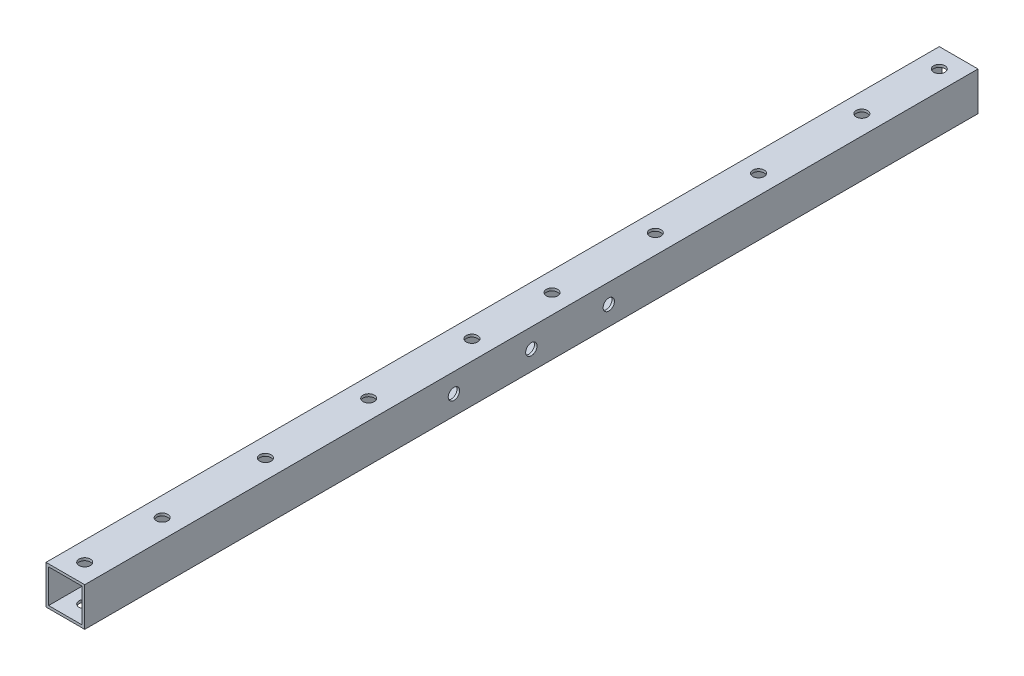
ISO-10303-21;
HEADER;
FILE_DESCRIPTION(('STEP AP214'),'2;1');
FILE_NAME('part.step','',(''),(''),'','','');
FILE_SCHEMA(('AUTOMOTIVE_DESIGN { 1 0 10303 214 1 1 1 1 }'));
ENDSEC;
DATA;
#1=APPLICATION_CONTEXT('core data for automotive mechanical design processes');
#2=APPLICATION_PROTOCOL_DEFINITION('international standard','automotive_design',2000,#1);
#3=PRODUCT_CONTEXT('',#1,'mechanical');
#4=PRODUCT('Part','Part','',(#3));
#5=PRODUCT_RELATED_PRODUCT_CATEGORY('part','',(#4));
#6=PRODUCT_DEFINITION_FORMATION('','',#4);
#7=PRODUCT_DEFINITION_CONTEXT('part definition',#1,'design');
#8=PRODUCT_DEFINITION('design','',#6,#7);
#9=PRODUCT_DEFINITION_SHAPE('','',#8);
#10=(LENGTH_UNIT() NAMED_UNIT(*) SI_UNIT(.MILLI.,.METRE.));
#11=(NAMED_UNIT(*) PLANE_ANGLE_UNIT() SI_UNIT($,.RADIAN.));
#12=(NAMED_UNIT(*) SI_UNIT($,.STERADIAN.) SOLID_ANGLE_UNIT());
#13=UNCERTAINTY_MEASURE_WITH_UNIT(LENGTH_MEASURE(1.E-05),#10,'distance_accuracy_value','');
#14=(GEOMETRIC_REPRESENTATION_CONTEXT(3) GLOBAL_UNCERTAINTY_ASSIGNED_CONTEXT((#13)) GLOBAL_UNIT_ASSIGNED_CONTEXT((#10,
#11,#12)) REPRESENTATION_CONTEXT('',''));
#15=CARTESIAN_POINT('',(0.,0.,0.));
#16=DIRECTION('',(0.,0.,1.));
#17=DIRECTION('',(1.,0.,0.));
#18=AXIS2_PLACEMENT_3D('',#15,#16,#17);
#19=CARTESIAN_POINT('',(0.,0.,346.));
#20=DIRECTION('',(0.,0.,1.));
#21=DIRECTION('',(1.,0.,0.));
#22=AXIS2_PLACEMENT_3D('',#19,#20,#21);
#23=PLANE('',#22);
#24=DIRECTION('',(0.,1.,0.));
#25=VECTOR('',#24,1.);
#26=CARTESIAN_POINT('',(7.5,7.5,346.));
#27=LINE('',#26,#25);
#28=CARTESIAN_POINT('',(7.5,-7.5,346.));
#29=VERTEX_POINT('',#28);
#30=CARTESIAN_POINT('',(7.5,7.5,346.));
#31=VERTEX_POINT('',#30);
#32=EDGE_CURVE('E143',#29,#31,#27,.T.);
#33=ORIENTED_EDGE('',*,*,#32,.T.);
#34=DIRECTION('',(-1.,0.,0.));
#35=VECTOR('',#34,1.);
#36=CARTESIAN_POINT('',(-7.5,7.5,346.));
#37=LINE('',#36,#35);
#38=CARTESIAN_POINT('',(-7.5,7.5,346.));
#39=VERTEX_POINT('',#38);
#40=EDGE_CURVE('E146',#31,#39,#37,.T.);
#41=ORIENTED_EDGE('',*,*,#40,.T.);
#42=DIRECTION('',(0.,-1.,0.));
#43=VECTOR('',#42,1.);
#44=CARTESIAN_POINT('',(-7.5,7.5,346.));
#45=LINE('',#44,#43);
#46=CARTESIAN_POINT('',(-7.5,-7.5,346.));
#47=VERTEX_POINT('',#46);
#48=EDGE_CURVE('E149',#39,#47,#45,.T.);
#49=ORIENTED_EDGE('',*,*,#48,.T.);
#50=DIRECTION('',(1.,0.,0.));
#51=VECTOR('',#50,1.);
#52=CARTESIAN_POINT('',(-7.5,-7.5,346.));
#53=LINE('',#52,#51);
#54=EDGE_CURVE('E151',#47,#29,#53,.T.);
#55=ORIENTED_EDGE('',*,*,#54,.T.);
#56=EDGE_LOOP('',(#33,#41,#49,#55));
#57=FACE_BOUND('',#56,.T.);
#58=DIRECTION('',(-1.,0.,0.));
#59=VECTOR('',#58,1.);
#60=CARTESIAN_POINT('',(-6.5,6.5,346.));
#61=LINE('',#60,#59);
#62=CARTESIAN_POINT('',(6.5,6.5,346.));
#63=VERTEX_POINT('',#62);
#64=CARTESIAN_POINT('',(-6.5,6.5,346.));
#65=VERTEX_POINT('',#64);
#66=EDGE_CURVE('E113',#63,#65,#61,.T.);
#67=ORIENTED_EDGE('',*,*,#66,.F.);
#68=DIRECTION('',(0.,1.,0.));
#69=VECTOR('',#68,1.);
#70=CARTESIAN_POINT('',(6.5,6.5,346.));
#71=LINE('',#70,#69);
#72=CARTESIAN_POINT('',(6.5,-6.5,346.));
#73=VERTEX_POINT('',#72);
#74=EDGE_CURVE('E105',#73,#63,#71,.T.);
#75=ORIENTED_EDGE('',*,*,#74,.F.);
#76=DIRECTION('',(1.,0.,0.));
#77=VECTOR('',#76,1.);
#78=CARTESIAN_POINT('',(-6.5,-6.5,346.));
#79=LINE('',#78,#77);
#80=CARTESIAN_POINT('',(-6.5,-6.5,346.));
#81=VERTEX_POINT('',#80);
#82=EDGE_CURVE('E127',#81,#73,#79,.T.);
#83=ORIENTED_EDGE('',*,*,#82,.F.);
#84=DIRECTION('',(0.,-1.,0.));
#85=VECTOR('',#84,1.);
#86=CARTESIAN_POINT('',(-6.5,6.5,346.));
#87=LINE('',#86,#85);
#88=EDGE_CURVE('E125',#65,#81,#87,.T.);
#89=ORIENTED_EDGE('',*,*,#88,.F.);
#90=EDGE_LOOP('',(#67,#75,#83,#89));
#91=FACE_BOUND('',#90,.T.);
#92=ADVANCED_FACE('F38',(#57,#91),#23,.T.);
#93=CARTESIAN_POINT('',(0.,0.,0.));
#94=DIRECTION('',(0.,0.,1.));
#95=DIRECTION('',(1.,0.,0.));
#96=AXIS2_PLACEMENT_3D('',#93,#94,#95);
#97=PLANE('',#96);
#98=DIRECTION('',(0.,1.,0.));
#99=VECTOR('',#98,1.);
#100=CARTESIAN_POINT('',(7.5,7.5,0.));
#101=LINE('',#100,#99);
#102=CARTESIAN_POINT('',(7.5,-7.5,0.));
#103=VERTEX_POINT('',#102);
#104=CARTESIAN_POINT('',(7.5,7.5,0.));
#105=VERTEX_POINT('',#104);
#106=EDGE_CURVE('E121',#103,#105,#101,.T.);
#107=ORIENTED_EDGE('',*,*,#106,.F.);
#108=DIRECTION('',(1.,0.,0.));
#109=VECTOR('',#108,1.);
#110=CARTESIAN_POINT('',(-7.5,-7.5,0.));
#111=LINE('',#110,#109);
#112=CARTESIAN_POINT('',(-7.5,-7.5,0.));
#113=VERTEX_POINT('',#112);
#114=EDGE_CURVE('E147',#113,#103,#111,.T.);
#115=ORIENTED_EDGE('',*,*,#114,.F.);
#116=DIRECTION('',(0.,-1.,0.));
#117=VECTOR('',#116,1.);
#118=CARTESIAN_POINT('',(-7.5,7.5,0.));
#119=LINE('',#118,#117);
#120=CARTESIAN_POINT('',(-7.5,7.5,0.));
#121=VERTEX_POINT('',#120);
#122=EDGE_CURVE('E158',#121,#113,#119,.T.);
#123=ORIENTED_EDGE('',*,*,#122,.F.);
#124=DIRECTION('',(-1.,0.,0.));
#125=VECTOR('',#124,1.);
#126=CARTESIAN_POINT('',(-7.5,7.5,0.));
#127=LINE('',#126,#125);
#128=EDGE_CURVE('E156',#105,#121,#127,.T.);
#129=ORIENTED_EDGE('',*,*,#128,.F.);
#130=EDGE_LOOP('',(#107,#115,#123,#129));
#131=FACE_BOUND('',#130,.T.);
#132=DIRECTION('',(0.,1.,0.));
#133=VECTOR('',#132,1.);
#134=CARTESIAN_POINT('',(6.5,6.5,0.));
#135=LINE('',#134,#133);
#136=CARTESIAN_POINT('',(6.5,-6.5,0.));
#137=VERTEX_POINT('',#136);
#138=CARTESIAN_POINT('',(6.5,6.5,0.));
#139=VERTEX_POINT('',#138);
#140=EDGE_CURVE('E63',#137,#139,#135,.T.);
#141=ORIENTED_EDGE('',*,*,#140,.T.);
#142=DIRECTION('',(-1.,0.,0.));
#143=VECTOR('',#142,1.);
#144=CARTESIAN_POINT('',(-6.5,6.5,0.));
#145=LINE('',#144,#143);
#146=CARTESIAN_POINT('',(-6.5,6.5,0.));
#147=VERTEX_POINT('',#146);
#148=EDGE_CURVE('E120',#139,#147,#145,.T.);
#149=ORIENTED_EDGE('',*,*,#148,.T.);
#150=DIRECTION('',(0.,-1.,0.));
#151=VECTOR('',#150,1.);
#152=CARTESIAN_POINT('',(-6.5,6.5,0.));
#153=LINE('',#152,#151);
#154=CARTESIAN_POINT('',(-6.5,-6.5,0.));
#155=VERTEX_POINT('',#154);
#156=EDGE_CURVE('E135',#147,#155,#153,.T.);
#157=ORIENTED_EDGE('',*,*,#156,.T.);
#158=DIRECTION('',(1.,0.,0.));
#159=VECTOR('',#158,1.);
#160=CARTESIAN_POINT('',(-6.5,-6.5,0.));
#161=LINE('',#160,#159);
#162=EDGE_CURVE('E114',#155,#137,#161,.T.);
#163=ORIENTED_EDGE('',*,*,#162,.T.);
#164=EDGE_LOOP('',(#141,#149,#157,#163));
#165=FACE_BOUND('',#164,.T.);
#166=ADVANCED_FACE('F343',(#131,#165),#97,.F.);
#167=CARTESIAN_POINT('',(7.5,7.5,346.));
#168=DIRECTION('',(-1.,0.,0.));
#169=DIRECTION('',(0.,0.,1.));
#170=AXIS2_PLACEMENT_3D('',#167,#168,#169);
#171=PLANE('',#170);
#172=CARTESIAN_POINT('',(7.5,0.,143.));
#173=DIRECTION('',(1.,0.,0.));
#174=DIRECTION('',(0.,0.,-1.));
#175=AXIS2_PLACEMENT_3D('',#172,#173,#174);
#176=CIRCLE('',#175,2.20000000000001);
#177=CARTESIAN_POINT('',(7.5,0.,140.8));
#178=VERTEX_POINT('',#177);
#179=EDGE_CURVE('E832',#178,#178,#176,.T.);
#180=ORIENTED_EDGE('',*,*,#179,.F.);
#181=EDGE_LOOP('',(#180));
#182=FACE_BOUND('',#181,.T.);
#183=CARTESIAN_POINT('',(7.5,0.,203.));
#184=DIRECTION('',(1.,0.,0.));
#185=DIRECTION('',(0.,0.,-1.));
#186=AXIS2_PLACEMENT_3D('',#183,#184,#185);
#187=CIRCLE('',#186,2.20000000000001);
#188=CARTESIAN_POINT('',(7.5,0.,200.8));
#189=VERTEX_POINT('',#188);
#190=EDGE_CURVE('E833',#189,#189,#187,.T.);
#191=ORIENTED_EDGE('',*,*,#190,.F.);
#192=EDGE_LOOP('',(#191));
#193=FACE_BOUND('',#192,.T.);
#194=CARTESIAN_POINT('',(7.5,0.,173.));
#195=DIRECTION('',(1.,0.,0.));
#196=DIRECTION('',(0.,0.,-1.));
#197=AXIS2_PLACEMENT_3D('',#194,#195,#196);
#198=CIRCLE('',#197,2.20000000000001);
#199=CARTESIAN_POINT('',(7.5,0.,170.8));
#200=VERTEX_POINT('',#199);
#201=EDGE_CURVE('E221',#200,#200,#198,.T.);
#202=ORIENTED_EDGE('',*,*,#201,.F.);
#203=EDGE_LOOP('',(#202));
#204=FACE_BOUND('',#203,.T.);
#205=ORIENTED_EDGE('',*,*,#106,.T.);
#206=DIRECTION('',(0.,0.,-1.));
#207=VECTOR('',#206,1.);
#208=CARTESIAN_POINT('',(7.5,7.5,346.));
#209=LINE('',#208,#207);
#210=EDGE_CURVE('E11',#31,#105,#209,.T.);
#211=ORIENTED_EDGE('',*,*,#210,.F.);
#212=ORIENTED_EDGE('',*,*,#32,.F.);
#213=DIRECTION('',(0.,0.,-1.));
#214=VECTOR('',#213,1.);
#215=CARTESIAN_POINT('',(7.5,-7.5,346.));
#216=LINE('',#215,#214);
#217=EDGE_CURVE('E153',#29,#103,#216,.T.);
#218=ORIENTED_EDGE('',*,*,#217,.T.);
#219=EDGE_LOOP('',(#205,#211,#212,#218));
#220=FACE_BOUND('',#219,.T.);
#221=ADVANCED_FACE('F40',(#182,#193,#204,#220),#171,.F.);
#222=CARTESIAN_POINT('',(-7.5,7.5,346.));
#223=DIRECTION('',(0.,-1.,0.));
#224=DIRECTION('',(0.,0.,-1.));
#225=AXIS2_PLACEMENT_3D('',#222,#223,#224);
#226=PLANE('',#225);
#227=CARTESIAN_POINT('',(0.,7.5,338.5));
#228=DIRECTION('',(0.,1.,0.));
#229=DIRECTION('',(0.,0.,1.));
#230=AXIS2_PLACEMENT_3D('',#227,#228,#229);
#231=CIRCLE('',#230,2.19999999999999);
#232=CARTESIAN_POINT('',(0.,7.5,340.7));
#233=VERTEX_POINT('',#232);
#234=EDGE_CURVE('E172',#233,#233,#231,.T.);
#235=ORIENTED_EDGE('',*,*,#234,.F.);
#236=EDGE_LOOP('',(#235));
#237=FACE_BOUND('',#236,.T.);
#238=CARTESIAN_POINT('',(0.,7.5,188.5));
#239=DIRECTION('',(0.,1.,0.));
#240=DIRECTION('',(0.,0.,-1.));
#241=AXIS2_PLACEMENT_3D('',#238,#239,#240);
#242=CIRCLE('',#241,2.2);
#243=CARTESIAN_POINT('',(0.,7.5,186.3));
#244=VERTEX_POINT('',#243);
#245=EDGE_CURVE('E247',#244,#244,#242,.T.);
#246=ORIENTED_EDGE('',*,*,#245,.F.);
#247=EDGE_LOOP('',(#246));
#248=FACE_BOUND('',#247,.T.);
#249=CARTESIAN_POINT('',(0.,7.5,7.5));
#250=DIRECTION('',(0.,1.,0.));
#251=DIRECTION('',(0.,0.,1.));
#252=AXIS2_PLACEMENT_3D('',#249,#250,#251);
#253=CIRCLE('',#252,2.2);
#254=CARTESIAN_POINT('',(0.,7.5,9.7));
#255=VERTEX_POINT('',#254);
#256=EDGE_CURVE('E250',#255,#255,#253,.T.);
#257=ORIENTED_EDGE('',*,*,#256,.F.);
#258=EDGE_LOOP('',(#257));
#259=FACE_BOUND('',#258,.T.);
#260=CARTESIAN_POINT('',(0.,7.5,37.5));
#261=DIRECTION('',(0.,1.,0.));
#262=DIRECTION('',(0.,0.,1.));
#263=AXIS2_PLACEMENT_3D('',#260,#261,#262);
#264=CIRCLE('',#263,2.2);
#265=CARTESIAN_POINT('',(0.,7.5,39.7));
#266=VERTEX_POINT('',#265);
#267=EDGE_CURVE('E268',#266,#266,#264,.T.);
#268=ORIENTED_EDGE('',*,*,#267,.F.);
#269=EDGE_LOOP('',(#268));
#270=FACE_BOUND('',#269,.T.);
#271=CARTESIAN_POINT('',(0.,7.5,308.5));
#272=DIRECTION('',(0.,1.,0.));
#273=DIRECTION('',(0.,0.,1.));
#274=AXIS2_PLACEMENT_3D('',#271,#272,#273);
#275=CIRCLE('',#274,2.19999999999998);
#276=CARTESIAN_POINT('',(0.,7.5,310.7));
#277=VERTEX_POINT('',#276);
#278=EDGE_CURVE('E271',#277,#277,#275,.T.);
#279=ORIENTED_EDGE('',*,*,#278,.F.);
#280=EDGE_LOOP('',(#279));
#281=FACE_BOUND('',#280,.T.);
#282=CARTESIAN_POINT('',(0.,7.5,77.5));
#283=DIRECTION('',(0.,1.,0.));
#284=DIRECTION('',(0.,0.,1.));
#285=AXIS2_PLACEMENT_3D('',#282,#283,#284);
#286=CIRCLE('',#285,2.2);
#287=CARTESIAN_POINT('',(0.,7.5,79.7));
#288=VERTEX_POINT('',#287);
#289=EDGE_CURVE('E263',#288,#288,#286,.T.);
#290=ORIENTED_EDGE('',*,*,#289,.F.);
#291=EDGE_LOOP('',(#290));
#292=FACE_BOUND('',#291,.T.);
#293=CARTESIAN_POINT('',(0.,7.5,157.5));
#294=DIRECTION('',(0.,1.,0.));
#295=DIRECTION('',(0.,0.,1.));
#296=AXIS2_PLACEMENT_3D('',#293,#294,#295);
#297=CIRCLE('',#296,2.2);
#298=CARTESIAN_POINT('',(0.,7.5,159.7));
#299=VERTEX_POINT('',#298);
#300=EDGE_CURVE('E253',#299,#299,#297,.T.);
#301=ORIENTED_EDGE('',*,*,#300,.F.);
#302=EDGE_LOOP('',(#301));
#303=FACE_BOUND('',#302,.T.);
#304=CARTESIAN_POINT('',(0.,7.5,268.5));
#305=DIRECTION('',(0.,1.,0.));
#306=DIRECTION('',(0.,0.,-1.));
#307=AXIS2_PLACEMENT_3D('',#304,#305,#306);
#308=CIRCLE('',#307,2.19999999999999);
#309=CARTESIAN_POINT('',(0.,7.5,266.3));
#310=VERTEX_POINT('',#309);
#311=EDGE_CURVE('E254',#310,#310,#308,.T.);
#312=ORIENTED_EDGE('',*,*,#311,.F.);
#313=EDGE_LOOP('',(#312));
#314=FACE_BOUND('',#313,.T.);
#315=CARTESIAN_POINT('',(0.,7.5,228.5));
#316=DIRECTION('',(0.,1.,0.));
#317=DIRECTION('',(0.,0.,-1.));
#318=AXIS2_PLACEMENT_3D('',#315,#316,#317);
#319=CIRCLE('',#318,2.19999999999999);
#320=CARTESIAN_POINT('',(0.,7.5,226.3));
#321=VERTEX_POINT('',#320);
#322=EDGE_CURVE('E257',#321,#321,#319,.T.);
#323=ORIENTED_EDGE('',*,*,#322,.F.);
#324=EDGE_LOOP('',(#323));
#325=FACE_BOUND('',#324,.T.);
#326=CARTESIAN_POINT('',(0.,7.5,117.5));
#327=DIRECTION('',(0.,1.,0.));
#328=DIRECTION('',(0.,0.,1.));
#329=AXIS2_PLACEMENT_3D('',#326,#327,#328);
#330=CIRCLE('',#329,2.2);
#331=CARTESIAN_POINT('',(0.,7.5,119.7));
#332=VERTEX_POINT('',#331);
#333=EDGE_CURVE('E260',#332,#332,#330,.T.);
#334=ORIENTED_EDGE('',*,*,#333,.F.);
#335=EDGE_LOOP('',(#334));
#336=FACE_BOUND('',#335,.T.);
#337=ORIENTED_EDGE('',*,*,#128,.T.);
#338=DIRECTION('',(0.,0.,-1.));
#339=VECTOR('',#338,1.);
#340=CARTESIAN_POINT('',(-7.5,7.5,346.));
#341=LINE('',#340,#339);
#342=EDGE_CURVE('E47',#39,#121,#341,.T.);
#343=ORIENTED_EDGE('',*,*,#342,.F.);
#344=ORIENTED_EDGE('',*,*,#40,.F.);
#345=ORIENTED_EDGE('',*,*,#210,.T.);
#346=EDGE_LOOP('',(#337,#343,#344,#345));
#347=FACE_BOUND('',#346,.T.);
#348=ADVANCED_FACE('F358',(#237,#248,#259,#270,#281,#292,#303,#314,#325,#336,#347),#226,.F.);
#349=CARTESIAN_POINT('',(-7.5,7.5,346.));
#350=DIRECTION('',(1.,0.,0.));
#351=DIRECTION('',(0.,0.,-1.));
#352=AXIS2_PLACEMENT_3D('',#349,#350,#351);
#353=PLANE('',#352);
#354=CARTESIAN_POINT('',(-7.49999999999999,0.,143.));
#355=DIRECTION('',(1.,0.,0.));
#356=DIRECTION('',(0.,0.,-1.));
#357=AXIS2_PLACEMENT_3D('',#354,#355,#356);
#358=CIRCLE('',#357,2.20000000000001);
#359=CARTESIAN_POINT('',(-7.49999999999999,0.,140.8));
#360=VERTEX_POINT('',#359);
#361=EDGE_CURVE('E244',#360,#360,#358,.T.);
#362=ORIENTED_EDGE('',*,*,#361,.T.);
#363=EDGE_LOOP('',(#362));
#364=FACE_BOUND('',#363,.T.);
#365=CARTESIAN_POINT('',(-7.49999999999999,0.,203.));
#366=DIRECTION('',(1.,0.,0.));
#367=DIRECTION('',(0.,0.,-1.));
#368=AXIS2_PLACEMENT_3D('',#365,#366,#367);
#369=CIRCLE('',#368,2.20000000000001);
#370=CARTESIAN_POINT('',(-7.49999999999999,0.,200.8));
#371=VERTEX_POINT('',#370);
#372=EDGE_CURVE('E229',#371,#371,#369,.T.);
#373=ORIENTED_EDGE('',*,*,#372,.T.);
#374=EDGE_LOOP('',(#373));
#375=FACE_BOUND('',#374,.T.);
#376=CARTESIAN_POINT('',(-7.49999999999999,0.,173.));
#377=DIRECTION('',(1.,0.,0.));
#378=DIRECTION('',(0.,0.,-1.));
#379=AXIS2_PLACEMENT_3D('',#376,#377,#378);
#380=CIRCLE('',#379,2.20000000000001);
#381=CARTESIAN_POINT('',(-7.49999999999999,0.,170.8));
#382=VERTEX_POINT('',#381);
#383=EDGE_CURVE('E225',#382,#382,#380,.T.);
#384=ORIENTED_EDGE('',*,*,#383,.T.);
#385=EDGE_LOOP('',(#384));
#386=FACE_BOUND('',#385,.T.);
#387=ORIENTED_EDGE('',*,*,#122,.T.);
#388=DIRECTION('',(0.,0.,-1.));
#389=VECTOR('',#388,1.);
#390=CARTESIAN_POINT('',(-7.5,-7.5,346.));
#391=LINE('',#390,#389);
#392=EDGE_CURVE('E163',#47,#113,#391,.T.);
#393=ORIENTED_EDGE('',*,*,#392,.F.);
#394=ORIENTED_EDGE('',*,*,#48,.F.);
#395=ORIENTED_EDGE('',*,*,#342,.T.);
#396=EDGE_LOOP('',(#387,#393,#394,#395));
#397=FACE_BOUND('',#396,.T.);
#398=ADVANCED_FACE('F356',(#364,#375,#386,#397),#353,.F.);
#399=CARTESIAN_POINT('',(-7.5,-7.5,346.));
#400=DIRECTION('',(0.,1.,0.));
#401=DIRECTION('',(0.,0.,1.));
#402=AXIS2_PLACEMENT_3D('',#399,#400,#401);
#403=PLANE('',#402);
#404=CARTESIAN_POINT('',(0.,-7.49999999999999,338.5));
#405=DIRECTION('',(0.,1.,0.));
#406=DIRECTION('',(0.,0.,1.));
#407=AXIS2_PLACEMENT_3D('',#404,#405,#406);
#408=CIRCLE('',#407,2.19999999999999);
#409=CARTESIAN_POINT('',(0.,-7.49999999999999,340.7));
#410=VERTEX_POINT('',#409);
#411=EDGE_CURVE('E133',#410,#410,#408,.T.);
#412=ORIENTED_EDGE('',*,*,#411,.T.);
#413=EDGE_LOOP('',(#412));
#414=FACE_BOUND('',#413,.T.);
#415=CARTESIAN_POINT('',(0.,-7.49999999999999,188.5));
#416=DIRECTION('',(0.,1.,0.));
#417=DIRECTION('',(0.,0.,1.));
#418=AXIS2_PLACEMENT_3D('',#415,#416,#417);
#419=CIRCLE('',#418,2.2);
#420=CARTESIAN_POINT('',(0.,-7.49999999999999,190.7));
#421=VERTEX_POINT('',#420);
#422=EDGE_CURVE('E217',#421,#421,#419,.T.);
#423=ORIENTED_EDGE('',*,*,#422,.T.);
#424=EDGE_LOOP('',(#423));
#425=FACE_BOUND('',#424,.T.);
#426=CARTESIAN_POINT('',(0.,-7.49999999999999,7.5));
#427=DIRECTION('',(0.,1.,0.));
#428=DIRECTION('',(0.,0.,1.));
#429=AXIS2_PLACEMENT_3D('',#426,#427,#428);
#430=CIRCLE('',#429,2.2);
#431=CARTESIAN_POINT('',(0.,-7.49999999999999,9.7));
#432=VERTEX_POINT('',#431);
#433=EDGE_CURVE('E212',#432,#432,#430,.T.);
#434=ORIENTED_EDGE('',*,*,#433,.T.);
#435=EDGE_LOOP('',(#434));
#436=FACE_BOUND('',#435,.T.);
#437=CARTESIAN_POINT('',(0.,-7.49999999999999,37.5));
#438=DIRECTION('',(0.,1.,0.));
#439=DIRECTION('',(0.,0.,1.));
#440=AXIS2_PLACEMENT_3D('',#437,#438,#439);
#441=CIRCLE('',#440,2.2);
#442=CARTESIAN_POINT('',(0.,-7.49999999999999,39.7));
#443=VERTEX_POINT('',#442);
#444=EDGE_CURVE('E207',#443,#443,#441,.T.);
#445=ORIENTED_EDGE('',*,*,#444,.T.);
#446=EDGE_LOOP('',(#445));
#447=FACE_BOUND('',#446,.T.);
#448=CARTESIAN_POINT('',(0.,-7.49999999999999,308.5));
#449=DIRECTION('',(0.,1.,0.));
#450=DIRECTION('',(0.,0.,1.));
#451=AXIS2_PLACEMENT_3D('',#448,#449,#450);
#452=CIRCLE('',#451,2.19999999999998);
#453=CARTESIAN_POINT('',(0.,-7.49999999999999,310.7));
#454=VERTEX_POINT('',#453);
#455=EDGE_CURVE('E202',#454,#454,#452,.T.);
#456=ORIENTED_EDGE('',*,*,#455,.T.);
#457=EDGE_LOOP('',(#456));
#458=FACE_BOUND('',#457,.T.);
#459=CARTESIAN_POINT('',(0.,-7.49999999999999,77.5));
#460=DIRECTION('',(0.,1.,0.));
#461=DIRECTION('',(0.,0.,1.));
#462=AXIS2_PLACEMENT_3D('',#459,#460,#461);
#463=CIRCLE('',#462,2.2);
#464=CARTESIAN_POINT('',(0.,-7.49999999999999,79.7));
#465=VERTEX_POINT('',#464);
#466=EDGE_CURVE('E197',#465,#465,#463,.T.);
#467=ORIENTED_EDGE('',*,*,#466,.T.);
#468=EDGE_LOOP('',(#467));
#469=FACE_BOUND('',#468,.T.);
#470=CARTESIAN_POINT('',(0.,-7.49999999999999,157.5));
#471=DIRECTION('',(0.,1.,0.));
#472=DIRECTION('',(0.,0.,1.));
#473=AXIS2_PLACEMENT_3D('',#470,#471,#472);
#474=CIRCLE('',#473,2.2);
#475=CARTESIAN_POINT('',(0.,-7.49999999999999,159.7));
#476=VERTEX_POINT('',#475);
#477=EDGE_CURVE('E192',#476,#476,#474,.T.);
#478=ORIENTED_EDGE('',*,*,#477,.T.);
#479=EDGE_LOOP('',(#478));
#480=FACE_BOUND('',#479,.T.);
#481=CARTESIAN_POINT('',(0.,-7.49999999999999,268.5));
#482=DIRECTION('',(0.,1.,0.));
#483=DIRECTION('',(0.,0.,1.));
#484=AXIS2_PLACEMENT_3D('',#481,#482,#483);
#485=CIRCLE('',#484,2.19999999999999);
#486=CARTESIAN_POINT('',(0.,-7.49999999999999,270.7));
#487=VERTEX_POINT('',#486);
#488=EDGE_CURVE('E187',#487,#487,#485,.T.);
#489=ORIENTED_EDGE('',*,*,#488,.T.);
#490=EDGE_LOOP('',(#489));
#491=FACE_BOUND('',#490,.T.);
#492=CARTESIAN_POINT('',(0.,-7.49999999999999,228.5));
#493=DIRECTION('',(0.,1.,0.));
#494=DIRECTION('',(0.,0.,1.));
#495=AXIS2_PLACEMENT_3D('',#492,#493,#494);
#496=CIRCLE('',#495,2.19999999999999);
#497=CARTESIAN_POINT('',(0.,-7.49999999999999,230.7));
#498=VERTEX_POINT('',#497);
#499=EDGE_CURVE('E182',#498,#498,#496,.T.);
#500=ORIENTED_EDGE('',*,*,#499,.T.);
#501=EDGE_LOOP('',(#500));
#502=FACE_BOUND('',#501,.T.);
#503=CARTESIAN_POINT('',(0.,-7.49999999999999,117.5));
#504=DIRECTION('',(0.,1.,0.));
#505=DIRECTION('',(0.,0.,1.));
#506=AXIS2_PLACEMENT_3D('',#503,#504,#505);
#507=CIRCLE('',#506,2.2);
#508=CARTESIAN_POINT('',(0.,-7.49999999999999,119.7));
#509=VERTEX_POINT('',#508);
#510=EDGE_CURVE('E177',#509,#509,#507,.T.);
#511=ORIENTED_EDGE('',*,*,#510,.T.);
#512=EDGE_LOOP('',(#511));
#513=FACE_BOUND('',#512,.T.);
#514=ORIENTED_EDGE('',*,*,#114,.T.);
#515=ORIENTED_EDGE('',*,*,#217,.F.);
#516=ORIENTED_EDGE('',*,*,#54,.F.);
#517=ORIENTED_EDGE('',*,*,#392,.T.);
#518=EDGE_LOOP('',(#514,#515,#516,#517));
#519=FACE_BOUND('',#518,.T.);
#520=ADVANCED_FACE('F316',(#414,#425,#436,#447,#458,#469,#480,#491,#502,#513,#519),#403,.F.);
#521=CARTESIAN_POINT('',(6.5,6.5,346.));
#522=DIRECTION('',(-1.,0.,0.));
#523=DIRECTION('',(0.,0.,1.));
#524=AXIS2_PLACEMENT_3D('',#521,#522,#523);
#525=PLANE('',#524);
#526=CARTESIAN_POINT('',(6.5,0.,143.));
#527=DIRECTION('',(-1.,0.,0.));
#528=DIRECTION('',(0.,0.,1.));
#529=AXIS2_PLACEMENT_3D('',#526,#527,#528);
#530=CIRCLE('',#529,2.20000000000001);
#531=CARTESIAN_POINT('',(6.5,0.,145.2));
#532=VERTEX_POINT('',#531);
#533=EDGE_CURVE('E241',#532,#532,#530,.T.);
#534=ORIENTED_EDGE('',*,*,#533,.F.);
#535=EDGE_LOOP('',(#534));
#536=FACE_BOUND('',#535,.T.);
#537=CARTESIAN_POINT('',(6.5,0.,203.));
#538=DIRECTION('',(-1.,0.,0.));
#539=DIRECTION('',(0.,0.,1.));
#540=AXIS2_PLACEMENT_3D('',#537,#538,#539);
#541=CIRCLE('',#540,2.20000000000001);
#542=CARTESIAN_POINT('',(6.5,0.,205.2));
#543=VERTEX_POINT('',#542);
#544=EDGE_CURVE('E224',#543,#543,#541,.T.);
#545=ORIENTED_EDGE('',*,*,#544,.F.);
#546=EDGE_LOOP('',(#545));
#547=FACE_BOUND('',#546,.T.);
#548=CARTESIAN_POINT('',(6.5,0.,173.));
#549=DIRECTION('',(-1.,0.,0.));
#550=DIRECTION('',(0.,0.,1.));
#551=AXIS2_PLACEMENT_3D('',#548,#549,#550);
#552=CIRCLE('',#551,2.20000000000001);
#553=CARTESIAN_POINT('',(6.5,0.,175.2));
#554=VERTEX_POINT('',#553);
#555=EDGE_CURVE('E220',#554,#554,#552,.T.);
#556=ORIENTED_EDGE('',*,*,#555,.F.);
#557=EDGE_LOOP('',(#556));
#558=FACE_BOUND('',#557,.T.);
#559=ORIENTED_EDGE('',*,*,#140,.F.);
#560=DIRECTION('',(0.,0.,-1.));
#561=VECTOR('',#560,1.);
#562=CARTESIAN_POINT('',(6.5,-6.5,346.));
#563=LINE('',#562,#561);
#564=EDGE_CURVE('E109',#73,#137,#563,.T.);
#565=ORIENTED_EDGE('',*,*,#564,.F.);
#566=ORIENTED_EDGE('',*,*,#74,.T.);
#567=DIRECTION('',(0.,0.,-1.));
#568=VECTOR('',#567,1.);
#569=CARTESIAN_POINT('',(6.5,6.5,346.));
#570=LINE('',#569,#568);
#571=EDGE_CURVE('E108',#63,#139,#570,.T.);
#572=ORIENTED_EDGE('',*,*,#571,.T.);
#573=EDGE_LOOP('',(#559,#565,#566,#572));
#574=FACE_BOUND('',#573,.T.);
#575=ADVANCED_FACE('F107',(#536,#547,#558,#574),#525,.T.);
#576=CARTESIAN_POINT('',(-6.5,6.5,346.));
#577=DIRECTION('',(0.,-1.,0.));
#578=DIRECTION('',(0.,0.,-1.));
#579=AXIS2_PLACEMENT_3D('',#576,#577,#578);
#580=PLANE('',#579);
#581=CARTESIAN_POINT('',(0.,6.5,338.5));
#582=DIRECTION('',(0.,-1.,0.));
#583=DIRECTION('',(0.,0.,-1.));
#584=AXIS2_PLACEMENT_3D('',#581,#582,#583);
#585=CIRCLE('',#584,2.19999999999999);
#586=CARTESIAN_POINT('',(0.,6.5,336.3));
#587=VERTEX_POINT('',#586);
#588=EDGE_CURVE('E216',#587,#587,#585,.T.);
#589=ORIENTED_EDGE('',*,*,#588,.F.);
#590=EDGE_LOOP('',(#589));
#591=FACE_BOUND('',#590,.T.);
#592=CARTESIAN_POINT('',(0.,6.5,188.5));
#593=DIRECTION('',(0.,-1.,0.));
#594=DIRECTION('',(0.,0.,-1.));
#595=AXIS2_PLACEMENT_3D('',#592,#593,#594);
#596=CIRCLE('',#595,2.2);
#597=CARTESIAN_POINT('',(0.,6.5,186.3));
#598=VERTEX_POINT('',#597);
#599=EDGE_CURVE('E211',#598,#598,#596,.T.);
#600=ORIENTED_EDGE('',*,*,#599,.F.);
#601=EDGE_LOOP('',(#600));
#602=FACE_BOUND('',#601,.T.);
#603=CARTESIAN_POINT('',(0.,6.5,7.5));
#604=DIRECTION('',(0.,-1.,0.));
#605=DIRECTION('',(0.,0.,-1.));
#606=AXIS2_PLACEMENT_3D('',#603,#604,#605);
#607=CIRCLE('',#606,2.2);
#608=CARTESIAN_POINT('',(0.,6.5,5.3));
#609=VERTEX_POINT('',#608);
#610=EDGE_CURVE('E206',#609,#609,#607,.T.);
#611=ORIENTED_EDGE('',*,*,#610,.F.);
#612=EDGE_LOOP('',(#611));
#613=FACE_BOUND('',#612,.T.);
#614=CARTESIAN_POINT('',(0.,6.5,37.5));
#615=DIRECTION('',(0.,-1.,0.));
#616=DIRECTION('',(0.,0.,-1.));
#617=AXIS2_PLACEMENT_3D('',#614,#615,#616);
#618=CIRCLE('',#617,2.2);
#619=CARTESIAN_POINT('',(0.,6.5,35.3));
#620=VERTEX_POINT('',#619);
#621=EDGE_CURVE('E201',#620,#620,#618,.T.);
#622=ORIENTED_EDGE('',*,*,#621,.F.);
#623=EDGE_LOOP('',(#622));
#624=FACE_BOUND('',#623,.T.);
#625=CARTESIAN_POINT('',(0.,6.5,308.5));
#626=DIRECTION('',(0.,-1.,0.));
#627=DIRECTION('',(0.,0.,-1.));
#628=AXIS2_PLACEMENT_3D('',#625,#626,#627);
#629=CIRCLE('',#628,2.19999999999998);
#630=CARTESIAN_POINT('',(0.,6.5,306.3));
#631=VERTEX_POINT('',#630);
#632=EDGE_CURVE('E196',#631,#631,#629,.T.);
#633=ORIENTED_EDGE('',*,*,#632,.F.);
#634=EDGE_LOOP('',(#633));
#635=FACE_BOUND('',#634,.T.);
#636=CARTESIAN_POINT('',(0.,6.5,77.5));
#637=DIRECTION('',(0.,-1.,0.));
#638=DIRECTION('',(0.,0.,-1.));
#639=AXIS2_PLACEMENT_3D('',#636,#637,#638);
#640=CIRCLE('',#639,2.2);
#641=CARTESIAN_POINT('',(0.,6.5,75.3));
#642=VERTEX_POINT('',#641);
#643=EDGE_CURVE('E191',#642,#642,#640,.T.);
#644=ORIENTED_EDGE('',*,*,#643,.F.);
#645=EDGE_LOOP('',(#644));
#646=FACE_BOUND('',#645,.T.);
#647=CARTESIAN_POINT('',(0.,6.5,157.5));
#648=DIRECTION('',(0.,-1.,0.));
#649=DIRECTION('',(0.,0.,-1.));
#650=AXIS2_PLACEMENT_3D('',#647,#648,#649);
#651=CIRCLE('',#650,2.2);
#652=CARTESIAN_POINT('',(0.,6.5,155.3));
#653=VERTEX_POINT('',#652);
#654=EDGE_CURVE('E186',#653,#653,#651,.T.);
#655=ORIENTED_EDGE('',*,*,#654,.F.);
#656=EDGE_LOOP('',(#655));
#657=FACE_BOUND('',#656,.T.);
#658=CARTESIAN_POINT('',(0.,6.5,268.5));
#659=DIRECTION('',(0.,-1.,0.));
#660=DIRECTION('',(0.,0.,-1.));
#661=AXIS2_PLACEMENT_3D('',#658,#659,#660);
#662=CIRCLE('',#661,2.19999999999999);
#663=CARTESIAN_POINT('',(0.,6.5,266.3));
#664=VERTEX_POINT('',#663);
#665=EDGE_CURVE('E181',#664,#664,#662,.T.);
#666=ORIENTED_EDGE('',*,*,#665,.F.);
#667=EDGE_LOOP('',(#666));
#668=FACE_BOUND('',#667,.T.);
#669=CARTESIAN_POINT('',(0.,6.5,228.5));
#670=DIRECTION('',(0.,-1.,0.));
#671=DIRECTION('',(0.,0.,-1.));
#672=AXIS2_PLACEMENT_3D('',#669,#670,#671);
#673=CIRCLE('',#672,2.19999999999999);
#674=CARTESIAN_POINT('',(0.,6.5,226.3));
#675=VERTEX_POINT('',#674);
#676=EDGE_CURVE('E176',#675,#675,#673,.T.);
#677=ORIENTED_EDGE('',*,*,#676,.F.);
#678=EDGE_LOOP('',(#677));
#679=FACE_BOUND('',#678,.T.);
#680=CARTESIAN_POINT('',(0.,6.5,117.5));
#681=DIRECTION('',(0.,-1.,0.));
#682=DIRECTION('',(0.,0.,-1.));
#683=AXIS2_PLACEMENT_3D('',#680,#681,#682);
#684=CIRCLE('',#683,2.2);
#685=CARTESIAN_POINT('',(0.,6.5,115.3));
#686=VERTEX_POINT('',#685);
#687=EDGE_CURVE('E171',#686,#686,#684,.T.);
#688=ORIENTED_EDGE('',*,*,#687,.F.);
#689=EDGE_LOOP('',(#688));
#690=FACE_BOUND('',#689,.T.);
#691=ORIENTED_EDGE('',*,*,#148,.F.);
#692=ORIENTED_EDGE('',*,*,#571,.F.);
#693=ORIENTED_EDGE('',*,*,#66,.T.);
#694=DIRECTION('',(0.,0.,-1.));
#695=VECTOR('',#694,1.);
#696=CARTESIAN_POINT('',(-6.5,6.5,346.));
#697=LINE('',#696,#695);
#698=EDGE_CURVE('E122',#65,#147,#697,.T.);
#699=ORIENTED_EDGE('',*,*,#698,.T.);
#700=EDGE_LOOP('',(#691,#692,#693,#699));
#701=FACE_BOUND('',#700,.T.);
#702=ADVANCED_FACE('F117',(#591,#602,#613,#624,#635,#646,#657,#668,#679,#690,#701),#580,.T.);
#703=CARTESIAN_POINT('',(-6.5,6.5,346.));
#704=DIRECTION('',(1.,0.,0.));
#705=DIRECTION('',(0.,0.,-1.));
#706=AXIS2_PLACEMENT_3D('',#703,#704,#705);
#707=PLANE('',#706);
#708=CARTESIAN_POINT('',(-6.5,0.,143.));
#709=DIRECTION('',(1.,0.,0.));
#710=DIRECTION('',(0.,0.,-1.));
#711=AXIS2_PLACEMENT_3D('',#708,#709,#710);
#712=CIRCLE('',#711,2.20000000000001);
#713=CARTESIAN_POINT('',(-6.5,0.,140.8));
#714=VERTEX_POINT('',#713);
#715=EDGE_CURVE('E42',#714,#714,#712,.T.);
#716=ORIENTED_EDGE('',*,*,#715,.F.);
#717=EDGE_LOOP('',(#716));
#718=FACE_BOUND('',#717,.T.);
#719=CARTESIAN_POINT('',(-6.5,0.,203.));
#720=DIRECTION('',(1.,0.,0.));
#721=DIRECTION('',(0.,0.,-1.));
#722=AXIS2_PLACEMENT_3D('',#719,#720,#721);
#723=CIRCLE('',#722,2.20000000000001);
#724=CARTESIAN_POINT('',(-6.5,0.,200.8));
#725=VERTEX_POINT('',#724);
#726=EDGE_CURVE('E222',#725,#725,#723,.T.);
#727=ORIENTED_EDGE('',*,*,#726,.F.);
#728=EDGE_LOOP('',(#727));
#729=FACE_BOUND('',#728,.T.);
#730=CARTESIAN_POINT('',(-6.5,0.,173.));
#731=DIRECTION('',(1.,0.,0.));
#732=DIRECTION('',(0.,0.,-1.));
#733=AXIS2_PLACEMENT_3D('',#730,#731,#732);
#734=CIRCLE('',#733,2.20000000000001);
#735=CARTESIAN_POINT('',(-6.5,0.,170.8));
#736=VERTEX_POINT('',#735);
#737=EDGE_CURVE('E218',#736,#736,#734,.T.);
#738=ORIENTED_EDGE('',*,*,#737,.F.);
#739=EDGE_LOOP('',(#738));
#740=FACE_BOUND('',#739,.T.);
#741=ORIENTED_EDGE('',*,*,#156,.F.);
#742=ORIENTED_EDGE('',*,*,#698,.F.);
#743=ORIENTED_EDGE('',*,*,#88,.T.);
#744=DIRECTION('',(0.,0.,-1.));
#745=VECTOR('',#744,1.);
#746=CARTESIAN_POINT('',(-6.5,-6.5,346.));
#747=LINE('',#746,#745);
#748=EDGE_CURVE('E55',#81,#155,#747,.T.);
#749=ORIENTED_EDGE('',*,*,#748,.T.);
#750=EDGE_LOOP('',(#741,#742,#743,#749));
#751=FACE_BOUND('',#750,.T.);
#752=ADVANCED_FACE('F403',(#718,#729,#740,#751),#707,.T.);
#753=CARTESIAN_POINT('',(-6.5,-6.5,346.));
#754=DIRECTION('',(0.,1.,0.));
#755=DIRECTION('',(0.,0.,1.));
#756=AXIS2_PLACEMENT_3D('',#753,#754,#755);
#757=PLANE('',#756);
#758=CARTESIAN_POINT('',(0.,-6.50000000000001,338.5));
#759=DIRECTION('',(0.,1.,0.));
#760=DIRECTION('',(0.,0.,1.));
#761=AXIS2_PLACEMENT_3D('',#758,#759,#760);
#762=CIRCLE('',#761,2.19999999999999);
#763=CARTESIAN_POINT('',(0.,-6.50000000000001,340.7));
#764=VERTEX_POINT('',#763);
#765=EDGE_CURVE('E213',#764,#764,#762,.T.);
#766=ORIENTED_EDGE('',*,*,#765,.F.);
#767=EDGE_LOOP('',(#766));
#768=FACE_BOUND('',#767,.T.);
#769=CARTESIAN_POINT('',(0.,-6.50000000000001,188.5));
#770=DIRECTION('',(0.,1.,0.));
#771=DIRECTION('',(0.,0.,1.));
#772=AXIS2_PLACEMENT_3D('',#769,#770,#771);
#773=CIRCLE('',#772,2.2);
#774=CARTESIAN_POINT('',(0.,-6.50000000000001,190.7));
#775=VERTEX_POINT('',#774);
#776=EDGE_CURVE('E208',#775,#775,#773,.T.);
#777=ORIENTED_EDGE('',*,*,#776,.F.);
#778=EDGE_LOOP('',(#777));
#779=FACE_BOUND('',#778,.T.);
#780=CARTESIAN_POINT('',(0.,-6.50000000000001,7.5));
#781=DIRECTION('',(0.,1.,0.));
#782=DIRECTION('',(0.,0.,1.));
#783=AXIS2_PLACEMENT_3D('',#780,#781,#782);
#784=CIRCLE('',#783,2.2);
#785=CARTESIAN_POINT('',(0.,-6.50000000000001,9.7));
#786=VERTEX_POINT('',#785);
#787=EDGE_CURVE('E203',#786,#786,#784,.T.);
#788=ORIENTED_EDGE('',*,*,#787,.F.);
#789=EDGE_LOOP('',(#788));
#790=FACE_BOUND('',#789,.T.);
#791=CARTESIAN_POINT('',(0.,-6.50000000000001,37.5));
#792=DIRECTION('',(0.,1.,0.));
#793=DIRECTION('',(0.,0.,1.));
#794=AXIS2_PLACEMENT_3D('',#791,#792,#793);
#795=CIRCLE('',#794,2.2);
#796=CARTESIAN_POINT('',(0.,-6.50000000000001,39.7));
#797=VERTEX_POINT('',#796);
#798=EDGE_CURVE('E198',#797,#797,#795,.T.);
#799=ORIENTED_EDGE('',*,*,#798,.F.);
#800=EDGE_LOOP('',(#799));
#801=FACE_BOUND('',#800,.T.);
#802=CARTESIAN_POINT('',(0.,-6.50000000000001,308.5));
#803=DIRECTION('',(0.,1.,0.));
#804=DIRECTION('',(0.,0.,1.));
#805=AXIS2_PLACEMENT_3D('',#802,#803,#804);
#806=CIRCLE('',#805,2.19999999999998);
#807=CARTESIAN_POINT('',(0.,-6.50000000000001,310.7));
#808=VERTEX_POINT('',#807);
#809=EDGE_CURVE('E193',#808,#808,#806,.T.);
#810=ORIENTED_EDGE('',*,*,#809,.F.);
#811=EDGE_LOOP('',(#810));
#812=FACE_BOUND('',#811,.T.);
#813=CARTESIAN_POINT('',(0.,-6.50000000000001,77.5));
#814=DIRECTION('',(0.,1.,0.));
#815=DIRECTION('',(0.,0.,1.));
#816=AXIS2_PLACEMENT_3D('',#813,#814,#815);
#817=CIRCLE('',#816,2.2);
#818=CARTESIAN_POINT('',(0.,-6.50000000000001,79.7));
#819=VERTEX_POINT('',#818);
#820=EDGE_CURVE('E188',#819,#819,#817,.T.);
#821=ORIENTED_EDGE('',*,*,#820,.F.);
#822=EDGE_LOOP('',(#821));
#823=FACE_BOUND('',#822,.T.);
#824=CARTESIAN_POINT('',(0.,-6.50000000000001,157.5));
#825=DIRECTION('',(0.,1.,0.));
#826=DIRECTION('',(0.,0.,1.));
#827=AXIS2_PLACEMENT_3D('',#824,#825,#826);
#828=CIRCLE('',#827,2.2);
#829=CARTESIAN_POINT('',(0.,-6.50000000000001,159.7));
#830=VERTEX_POINT('',#829);
#831=EDGE_CURVE('E183',#830,#830,#828,.T.);
#832=ORIENTED_EDGE('',*,*,#831,.F.);
#833=EDGE_LOOP('',(#832));
#834=FACE_BOUND('',#833,.T.);
#835=CARTESIAN_POINT('',(0.,-6.50000000000001,268.5));
#836=DIRECTION('',(0.,1.,0.));
#837=DIRECTION('',(0.,0.,1.));
#838=AXIS2_PLACEMENT_3D('',#835,#836,#837);
#839=CIRCLE('',#838,2.19999999999999);
#840=CARTESIAN_POINT('',(0.,-6.50000000000001,270.7));
#841=VERTEX_POINT('',#840);
#842=EDGE_CURVE('E178',#841,#841,#839,.T.);
#843=ORIENTED_EDGE('',*,*,#842,.F.);
#844=EDGE_LOOP('',(#843));
#845=FACE_BOUND('',#844,.T.);
#846=CARTESIAN_POINT('',(0.,-6.50000000000001,228.5));
#847=DIRECTION('',(0.,1.,0.));
#848=DIRECTION('',(0.,0.,1.));
#849=AXIS2_PLACEMENT_3D('',#846,#847,#848);
#850=CIRCLE('',#849,2.19999999999999);
#851=CARTESIAN_POINT('',(0.,-6.50000000000001,230.7));
#852=VERTEX_POINT('',#851);
#853=EDGE_CURVE('E173',#852,#852,#850,.T.);
#854=ORIENTED_EDGE('',*,*,#853,.F.);
#855=EDGE_LOOP('',(#854));
#856=FACE_BOUND('',#855,.T.);
#857=CARTESIAN_POINT('',(0.,-6.50000000000001,117.5));
#858=DIRECTION('',(0.,1.,0.));
#859=DIRECTION('',(0.,0.,1.));
#860=AXIS2_PLACEMENT_3D('',#857,#858,#859);
#861=CIRCLE('',#860,2.2);
#862=CARTESIAN_POINT('',(0.,-6.50000000000001,119.7));
#863=VERTEX_POINT('',#862);
#864=EDGE_CURVE('E168',#863,#863,#861,.T.);
#865=ORIENTED_EDGE('',*,*,#864,.F.);
#866=EDGE_LOOP('',(#865));
#867=FACE_BOUND('',#866,.T.);
#868=ORIENTED_EDGE('',*,*,#162,.F.);
#869=ORIENTED_EDGE('',*,*,#748,.F.);
#870=ORIENTED_EDGE('',*,*,#82,.T.);
#871=ORIENTED_EDGE('',*,*,#564,.T.);
#872=EDGE_LOOP('',(#868,#869,#870,#871));
#873=FACE_BOUND('',#872,.T.);
#874=ADVANCED_FACE('F401',(#768,#779,#790,#801,#812,#823,#834,#845,#856,#867,#873),#757,.T.);
#875=CARTESIAN_POINT('',(0.,-47.5,117.5));
#876=DIRECTION('',(0.,1.,0.));
#877=DIRECTION('',(0.,0.,1.));
#878=AXIS2_PLACEMENT_3D('',#875,#876,#877);
#879=CYLINDRICAL_SURFACE('',#878,2.2);
#880=ORIENTED_EDGE('',*,*,#864,.T.);
#881=EDGE_LOOP('',(#880));
#882=FACE_BOUND('',#881,.T.);
#883=ORIENTED_EDGE('',*,*,#510,.F.);
#884=EDGE_LOOP('',(#883));
#885=FACE_BOUND('',#884,.T.);
#886=ADVANCED_FACE('F333',(#882,#885),#879,.F.);
#887=CARTESIAN_POINT('',(0.,-47.5,228.5));
#888=DIRECTION('',(0.,1.,0.));
#889=DIRECTION('',(0.,0.,1.));
#890=AXIS2_PLACEMENT_3D('',#887,#888,#889);
#891=CYLINDRICAL_SURFACE('',#890,2.19999999999999);
#892=ORIENTED_EDGE('',*,*,#853,.T.);
#893=EDGE_LOOP('',(#892));
#894=FACE_BOUND('',#893,.T.);
#895=ORIENTED_EDGE('',*,*,#499,.F.);
#896=EDGE_LOOP('',(#895));
#897=FACE_BOUND('',#896,.T.);
#898=ADVANCED_FACE('F410',(#894,#897),#891,.F.);
#899=CARTESIAN_POINT('',(0.,-47.5,268.5));
#900=DIRECTION('',(0.,1.,0.));
#901=DIRECTION('',(0.,0.,1.));
#902=AXIS2_PLACEMENT_3D('',#899,#900,#901);
#903=CYLINDRICAL_SURFACE('',#902,2.19999999999999);
#904=ORIENTED_EDGE('',*,*,#842,.T.);
#905=EDGE_LOOP('',(#904));
#906=FACE_BOUND('',#905,.T.);
#907=ORIENTED_EDGE('',*,*,#488,.F.);
#908=EDGE_LOOP('',(#907));
#909=FACE_BOUND('',#908,.T.);
#910=ADVANCED_FACE('F456',(#906,#909),#903,.F.);
#911=CARTESIAN_POINT('',(0.,-47.5,157.5));
#912=DIRECTION('',(0.,1.,0.));
#913=DIRECTION('',(0.,0.,1.));
#914=AXIS2_PLACEMENT_3D('',#911,#912,#913);
#915=CYLINDRICAL_SURFACE('',#914,2.2);
#916=ORIENTED_EDGE('',*,*,#831,.T.);
#917=EDGE_LOOP('',(#916));
#918=FACE_BOUND('',#917,.T.);
#919=ORIENTED_EDGE('',*,*,#477,.F.);
#920=EDGE_LOOP('',(#919));
#921=FACE_BOUND('',#920,.T.);
#922=ADVANCED_FACE('F463',(#918,#921),#915,.F.);
#923=CARTESIAN_POINT('',(0.,-47.5,77.5));
#924=DIRECTION('',(0.,1.,0.));
#925=DIRECTION('',(0.,0.,1.));
#926=AXIS2_PLACEMENT_3D('',#923,#924,#925);
#927=CYLINDRICAL_SURFACE('',#926,2.2);
#928=ORIENTED_EDGE('',*,*,#820,.T.);
#929=EDGE_LOOP('',(#928));
#930=FACE_BOUND('',#929,.T.);
#931=ORIENTED_EDGE('',*,*,#466,.F.);
#932=EDGE_LOOP('',(#931));
#933=FACE_BOUND('',#932,.T.);
#934=ADVANCED_FACE('F417',(#930,#933),#927,.F.);
#935=CARTESIAN_POINT('',(0.,-47.5,308.5));
#936=DIRECTION('',(0.,1.,0.));
#937=DIRECTION('',(0.,0.,1.));
#938=AXIS2_PLACEMENT_3D('',#935,#936,#937);
#939=CYLINDRICAL_SURFACE('',#938,2.19999999999998);
#940=ORIENTED_EDGE('',*,*,#809,.T.);
#941=EDGE_LOOP('',(#940));
#942=FACE_BOUND('',#941,.T.);
#943=ORIENTED_EDGE('',*,*,#455,.F.);
#944=EDGE_LOOP('',(#943));
#945=FACE_BOUND('',#944,.T.);
#946=ADVANCED_FACE('F488',(#942,#945),#939,.F.);
#947=CARTESIAN_POINT('',(0.,-47.5,37.5));
#948=DIRECTION('',(0.,1.,0.));
#949=DIRECTION('',(0.,0.,1.));
#950=AXIS2_PLACEMENT_3D('',#947,#948,#949);
#951=CYLINDRICAL_SURFACE('',#950,2.2);
#952=ORIENTED_EDGE('',*,*,#798,.T.);
#953=EDGE_LOOP('',(#952));
#954=FACE_BOUND('',#953,.T.);
#955=ORIENTED_EDGE('',*,*,#444,.F.);
#956=EDGE_LOOP('',(#955));
#957=FACE_BOUND('',#956,.T.);
#958=ADVANCED_FACE('F512',(#954,#957),#951,.F.);
#959=CARTESIAN_POINT('',(0.,-47.5,7.5));
#960=DIRECTION('',(0.,1.,0.));
#961=DIRECTION('',(0.,0.,1.));
#962=AXIS2_PLACEMENT_3D('',#959,#960,#961);
#963=CYLINDRICAL_SURFACE('',#962,2.2);
#964=ORIENTED_EDGE('',*,*,#787,.T.);
#965=EDGE_LOOP('',(#964));
#966=FACE_BOUND('',#965,.T.);
#967=ORIENTED_EDGE('',*,*,#433,.F.);
#968=EDGE_LOOP('',(#967));
#969=FACE_BOUND('',#968,.T.);
#970=ADVANCED_FACE('F334',(#966,#969),#963,.F.);
#971=CARTESIAN_POINT('',(0.,-47.5,188.5));
#972=DIRECTION('',(0.,1.,0.));
#973=DIRECTION('',(0.,0.,1.));
#974=AXIS2_PLACEMENT_3D('',#971,#972,#973);
#975=CYLINDRICAL_SURFACE('',#974,2.2);
#976=ORIENTED_EDGE('',*,*,#776,.T.);
#977=EDGE_LOOP('',(#976));
#978=FACE_BOUND('',#977,.T.);
#979=ORIENTED_EDGE('',*,*,#422,.F.);
#980=EDGE_LOOP('',(#979));
#981=FACE_BOUND('',#980,.T.);
#982=ADVANCED_FACE('F322',(#978,#981),#975,.F.);
#983=CARTESIAN_POINT('',(0.,-47.5,338.5));
#984=DIRECTION('',(0.,1.,0.));
#985=DIRECTION('',(0.,0.,1.));
#986=AXIS2_PLACEMENT_3D('',#983,#984,#985);
#987=CYLINDRICAL_SURFACE('',#986,2.19999999999999);
#988=ORIENTED_EDGE('',*,*,#765,.T.);
#989=EDGE_LOOP('',(#988));
#990=FACE_BOUND('',#989,.T.);
#991=ORIENTED_EDGE('',*,*,#411,.F.);
#992=EDGE_LOOP('',(#991));
#993=FACE_BOUND('',#992,.T.);
#994=ADVANCED_FACE('F319',(#990,#993),#987,.F.);
#995=ORIENTED_EDGE('',*,*,#687,.T.);
#996=EDGE_LOOP('',(#995));
#997=FACE_BOUND('',#996,.T.);
#998=ORIENTED_EDGE('',*,*,#333,.T.);
#999=EDGE_LOOP('',(#998));
#1000=FACE_BOUND('',#999,.T.);
#1001=ADVANCED_FACE('F321',(#997,#1000),#879,.F.);
#1002=ORIENTED_EDGE('',*,*,#676,.T.);
#1003=EDGE_LOOP('',(#1002));
#1004=FACE_BOUND('',#1003,.T.);
#1005=ORIENTED_EDGE('',*,*,#322,.T.);
#1006=EDGE_LOOP('',(#1005));
#1007=FACE_BOUND('',#1006,.T.);
#1008=ADVANCED_FACE('F330',(#1004,#1007),#891,.F.);
#1009=ORIENTED_EDGE('',*,*,#665,.T.);
#1010=EDGE_LOOP('',(#1009));
#1011=FACE_BOUND('',#1010,.T.);
#1012=ORIENTED_EDGE('',*,*,#311,.T.);
#1013=EDGE_LOOP('',(#1012));
#1014=FACE_BOUND('',#1013,.T.);
#1015=ADVANCED_FACE('F448',(#1011,#1014),#903,.F.);
#1016=ORIENTED_EDGE('',*,*,#654,.T.);
#1017=EDGE_LOOP('',(#1016));
#1018=FACE_BOUND('',#1017,.T.);
#1019=ORIENTED_EDGE('',*,*,#300,.T.);
#1020=EDGE_LOOP('',(#1019));
#1021=FACE_BOUND('',#1020,.T.);
#1022=ADVANCED_FACE('F453',(#1018,#1021),#915,.F.);
#1023=ORIENTED_EDGE('',*,*,#643,.T.);
#1024=EDGE_LOOP('',(#1023));
#1025=FACE_BOUND('',#1024,.T.);
#1026=ORIENTED_EDGE('',*,*,#289,.T.);
#1027=EDGE_LOOP('',(#1026));
#1028=FACE_BOUND('',#1027,.T.);
#1029=ADVANCED_FACE('F490',(#1025,#1028),#927,.F.);
#1030=ORIENTED_EDGE('',*,*,#632,.T.);
#1031=EDGE_LOOP('',(#1030));
#1032=FACE_BOUND('',#1031,.T.);
#1033=ORIENTED_EDGE('',*,*,#278,.T.);
#1034=EDGE_LOOP('',(#1033));
#1035=FACE_BOUND('',#1034,.T.);
#1036=ADVANCED_FACE('F497',(#1032,#1035),#939,.F.);
#1037=ORIENTED_EDGE('',*,*,#621,.T.);
#1038=EDGE_LOOP('',(#1037));
#1039=FACE_BOUND('',#1038,.T.);
#1040=ORIENTED_EDGE('',*,*,#267,.T.);
#1041=EDGE_LOOP('',(#1040));
#1042=FACE_BOUND('',#1041,.T.);
#1043=ADVANCED_FACE('F503',(#1039,#1042),#951,.F.);
#1044=ORIENTED_EDGE('',*,*,#610,.T.);
#1045=EDGE_LOOP('',(#1044));
#1046=FACE_BOUND('',#1045,.T.);
#1047=ORIENTED_EDGE('',*,*,#256,.T.);
#1048=EDGE_LOOP('',(#1047));
#1049=FACE_BOUND('',#1048,.T.);
#1050=ADVANCED_FACE('F509',(#1046,#1049),#963,.F.);
#1051=ORIENTED_EDGE('',*,*,#599,.T.);
#1052=EDGE_LOOP('',(#1051));
#1053=FACE_BOUND('',#1052,.T.);
#1054=ORIENTED_EDGE('',*,*,#245,.T.);
#1055=EDGE_LOOP('',(#1054));
#1056=FACE_BOUND('',#1055,.T.);
#1057=ADVANCED_FACE('F337',(#1053,#1056),#975,.F.);
#1058=ORIENTED_EDGE('',*,*,#588,.T.);
#1059=EDGE_LOOP('',(#1058));
#1060=FACE_BOUND('',#1059,.T.);
#1061=ORIENTED_EDGE('',*,*,#234,.T.);
#1062=EDGE_LOOP('',(#1061));
#1063=FACE_BOUND('',#1062,.T.);
#1064=ADVANCED_FACE('F325',(#1060,#1063),#987,.F.);
#1065=CARTESIAN_POINT('',(-47.5,0.,173.));
#1066=DIRECTION('',(1.,0.,0.));
#1067=DIRECTION('',(0.,0.,-1.));
#1068=AXIS2_PLACEMENT_3D('',#1065,#1066,#1067);
#1069=CYLINDRICAL_SURFACE('',#1068,2.20000000000001);
#1070=ORIENTED_EDGE('',*,*,#737,.T.);
#1071=EDGE_LOOP('',(#1070));
#1072=FACE_BOUND('',#1071,.T.);
#1073=ORIENTED_EDGE('',*,*,#383,.F.);
#1074=EDGE_LOOP('',(#1073));
#1075=FACE_BOUND('',#1074,.T.);
#1076=ADVANCED_FACE('F340',(#1072,#1075),#1069,.F.);
#1077=CARTESIAN_POINT('',(-47.5,0.,203.));
#1078=DIRECTION('',(1.,0.,0.));
#1079=DIRECTION('',(0.,0.,-1.));
#1080=AXIS2_PLACEMENT_3D('',#1077,#1078,#1079);
#1081=CYLINDRICAL_SURFACE('',#1080,2.20000000000001);
#1082=ORIENTED_EDGE('',*,*,#726,.T.);
#1083=EDGE_LOOP('',(#1082));
#1084=FACE_BOUND('',#1083,.T.);
#1085=ORIENTED_EDGE('',*,*,#372,.F.);
#1086=EDGE_LOOP('',(#1085));
#1087=FACE_BOUND('',#1086,.T.);
#1088=ADVANCED_FACE('F567',(#1084,#1087),#1081,.F.);
#1089=CARTESIAN_POINT('',(-47.5,0.,143.));
#1090=DIRECTION('',(1.,0.,0.));
#1091=DIRECTION('',(0.,0.,-1.));
#1092=AXIS2_PLACEMENT_3D('',#1089,#1090,#1091);
#1093=CYLINDRICAL_SURFACE('',#1092,2.20000000000001);
#1094=ORIENTED_EDGE('',*,*,#715,.T.);
#1095=EDGE_LOOP('',(#1094));
#1096=FACE_BOUND('',#1095,.T.);
#1097=ORIENTED_EDGE('',*,*,#361,.F.);
#1098=EDGE_LOOP('',(#1097));
#1099=FACE_BOUND('',#1098,.T.);
#1100=ADVANCED_FACE('F576',(#1096,#1099),#1093,.F.);
#1101=ORIENTED_EDGE('',*,*,#555,.T.);
#1102=EDGE_LOOP('',(#1101));
#1103=FACE_BOUND('',#1102,.T.);
#1104=ORIENTED_EDGE('',*,*,#201,.T.);
#1105=EDGE_LOOP('',(#1104));
#1106=FACE_BOUND('',#1105,.T.);
#1107=ADVANCED_FACE('F569',(#1103,#1106),#1069,.F.);
#1108=ORIENTED_EDGE('',*,*,#544,.T.);
#1109=EDGE_LOOP('',(#1108));
#1110=FACE_BOUND('',#1109,.T.);
#1111=ORIENTED_EDGE('',*,*,#190,.T.);
#1112=EDGE_LOOP('',(#1111));
#1113=FACE_BOUND('',#1112,.T.);
#1114=ADVANCED_FACE('F578',(#1110,#1113),#1081,.F.);
#1115=ORIENTED_EDGE('',*,*,#533,.T.);
#1116=EDGE_LOOP('',(#1115));
#1117=FACE_BOUND('',#1116,.T.);
#1118=ORIENTED_EDGE('',*,*,#179,.T.);
#1119=EDGE_LOOP('',(#1118));
#1120=FACE_BOUND('',#1119,.T.);
#1121=ADVANCED_FACE('F586',(#1117,#1120),#1093,.F.);
#1122=CLOSED_SHELL('',(#92,#166,#221,#348,#398,#520,#575,#702,#752,#874,#886,#898,#910,#922,
#934,#946,#958,#970,#982,#994,#1001,#1008,#1015,#1022,#1029,#1036,#1043,#1050,#1057,#1064,#1076,
#1088,#1100,#1107,#1114,#1121));
#1123=MANIFOLD_SOLID_BREP('B2',#1122);
#1124=ADVANCED_BREP_SHAPE_REPRESENTATION('',(#18,#1123),#14);
#1125=SHAPE_DEFINITION_REPRESENTATION(#9,#1124);
ENDSEC;
END-ISO-10303-21;
